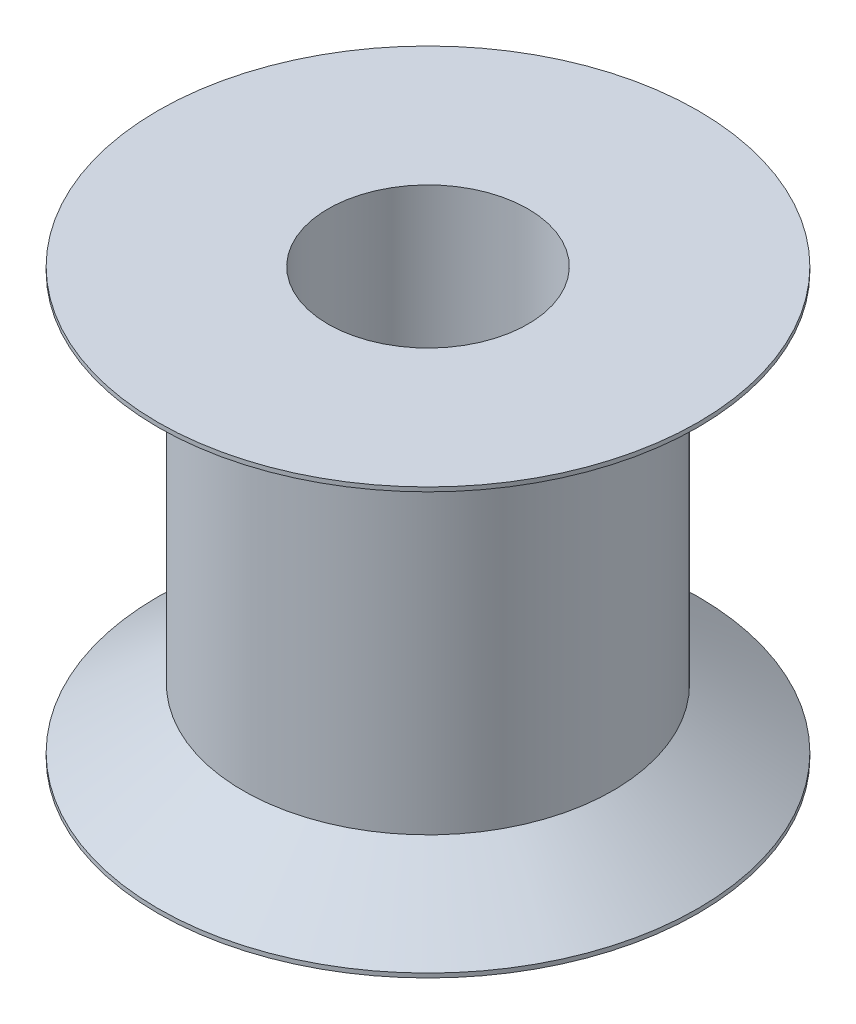
ISO-10303-21;
HEADER;
FILE_DESCRIPTION(('STEP AP214'),'2;1');
FILE_NAME('part.step','',(''),(''),'','','');
FILE_SCHEMA(('AUTOMOTIVE_DESIGN { 1 0 10303 214 1 1 1 1 }'));
ENDSEC;
DATA;
#1=APPLICATION_CONTEXT('core data for automotive mechanical design processes');
#2=APPLICATION_PROTOCOL_DEFINITION('international standard','automotive_design',2000,#1);
#3=PRODUCT_CONTEXT('',#1,'mechanical');
#4=PRODUCT('Part','Part','',(#3));
#5=PRODUCT_RELATED_PRODUCT_CATEGORY('part','',(#4));
#6=PRODUCT_DEFINITION_FORMATION('','',#4);
#7=PRODUCT_DEFINITION_CONTEXT('part definition',#1,'design');
#8=PRODUCT_DEFINITION('design','',#6,#7);
#9=PRODUCT_DEFINITION_SHAPE('','',#8);
#10=(LENGTH_UNIT() NAMED_UNIT(*) SI_UNIT(.MILLI.,.METRE.));
#11=(NAMED_UNIT(*) PLANE_ANGLE_UNIT() SI_UNIT($,.RADIAN.));
#12=(NAMED_UNIT(*) SI_UNIT($,.STERADIAN.) SOLID_ANGLE_UNIT());
#13=UNCERTAINTY_MEASURE_WITH_UNIT(LENGTH_MEASURE(1.E-05),#10,'distance_accuracy_value','');
#14=(GEOMETRIC_REPRESENTATION_CONTEXT(3) GLOBAL_UNCERTAINTY_ASSIGNED_CONTEXT((#13)) GLOBAL_UNIT_ASSIGNED_CONTEXT((#10,
#11,#12)) REPRESENTATION_CONTEXT('',''));
#15=CARTESIAN_POINT('',(0.,0.,0.));
#16=DIRECTION('',(0.,0.,1.));
#17=DIRECTION('',(1.,0.,0.));
#18=AXIS2_PLACEMENT_3D('',#15,#16,#17);
#19=CARTESIAN_POINT('',(0.,5.,-6.35));
#20=DIRECTION('',(0.,1.,0.));
#21=DIRECTION('',(0.,0.,1.));
#22=AXIS2_PLACEMENT_3D('',#19,#20,#21);
#23=PLANE('',#22);
#24=CARTESIAN_POINT('',(0.,5.,0.));
#25=DIRECTION('',(0.,-1.,0.));
#26=DIRECTION('',(0.,0.,-1.));
#27=AXIS2_PLACEMENT_3D('',#24,#25,#26);
#28=CIRCLE('',#27,2.35);
#29=CARTESIAN_POINT('',(0.,5.,-2.35));
#30=VERTEX_POINT('',#29);
#31=EDGE_CURVE('E10',#30,#30,#28,.T.);
#32=ORIENTED_EDGE('',*,*,#31,.T.);
#33=EDGE_LOOP('',(#32));
#34=FACE_BOUND('',#33,.T.);
#35=CARTESIAN_POINT('',(0.,5.,0.));
#36=DIRECTION('',(0.,-1.,0.));
#37=DIRECTION('',(0.,0.,-1.));
#38=AXIS2_PLACEMENT_3D('',#35,#36,#37);
#39=CIRCLE('',#38,6.35);
#40=CARTESIAN_POINT('',(0.,5.,-6.35));
#41=VERTEX_POINT('',#40);
#42=EDGE_CURVE('E62',#41,#41,#39,.T.);
#43=ORIENTED_EDGE('',*,*,#42,.F.);
#44=EDGE_LOOP('',(#43));
#45=FACE_BOUND('',#44,.T.);
#46=ADVANCED_FACE('F34',(#34,#45),#23,.T.);
#47=CARTESIAN_POINT('',(0.,0.,0.));
#48=DIRECTION('',(0.,-1.,0.));
#49=DIRECTION('',(0.,0.,-1.));
#50=AXIS2_PLACEMENT_3D('',#47,#48,#49);
#51=CYLINDRICAL_SURFACE('',#50,2.35);
#52=CARTESIAN_POINT('',(0.,-5.,0.));
#53=DIRECTION('',(0.,-1.,0.));
#54=DIRECTION('',(0.,0.,-1.));
#55=AXIS2_PLACEMENT_3D('',#52,#53,#54);
#56=CIRCLE('',#55,2.35);
#57=CARTESIAN_POINT('',(0.,-5.,-2.35));
#58=VERTEX_POINT('',#57);
#59=EDGE_CURVE('E40',#58,#58,#56,.T.);
#60=ORIENTED_EDGE('',*,*,#59,.T.);
#61=EDGE_LOOP('',(#60));
#62=FACE_BOUND('',#61,.T.);
#63=ORIENTED_EDGE('',*,*,#31,.F.);
#64=EDGE_LOOP('',(#63));
#65=FACE_BOUND('',#64,.T.);
#66=ADVANCED_FACE('F70',(#62,#65),#51,.F.);
#67=CARTESIAN_POINT('',(0.,-5.,-2.35));
#68=DIRECTION('',(0.,-1.,0.));
#69=DIRECTION('',(0.,0.,-1.));
#70=AXIS2_PLACEMENT_3D('',#67,#68,#69);
#71=PLANE('',#70);
#72=CARTESIAN_POINT('',(0.,-5.,0.));
#73=DIRECTION('',(0.,-1.,0.));
#74=DIRECTION('',(0.,0.,-1.));
#75=AXIS2_PLACEMENT_3D('',#72,#73,#74);
#76=CIRCLE('',#75,6.35);
#77=CARTESIAN_POINT('',(0.,-5.,-6.35));
#78=VERTEX_POINT('',#77);
#79=EDGE_CURVE('E44',#78,#78,#76,.T.);
#80=ORIENTED_EDGE('',*,*,#79,.T.);
#81=EDGE_LOOP('',(#80));
#82=FACE_BOUND('',#81,.T.);
#83=ORIENTED_EDGE('',*,*,#59,.F.);
#84=EDGE_LOOP('',(#83));
#85=FACE_BOUND('',#84,.T.);
#86=ADVANCED_FACE('F74',(#82,#85),#71,.T.);
#87=CARTESIAN_POINT('',(0.,0.,0.));
#88=DIRECTION('',(0.,-1.,0.));
#89=DIRECTION('',(0.,0.,-1.));
#90=AXIS2_PLACEMENT_3D('',#87,#88,#89);
#91=CYLINDRICAL_SURFACE('',#90,6.35);
#92=CARTESIAN_POINT('',(0.,-4.9,0.));
#93=DIRECTION('',(0.,-1.,0.));
#94=DIRECTION('',(0.,0.,-1.));
#95=AXIS2_PLACEMENT_3D('',#92,#93,#94);
#96=CIRCLE('',#95,6.35);
#97=CARTESIAN_POINT('',(0.,-4.9,-6.35));
#98=VERTEX_POINT('',#97);
#99=EDGE_CURVE('E48',#98,#98,#96,.T.);
#100=ORIENTED_EDGE('',*,*,#99,.T.);
#101=EDGE_LOOP('',(#100));
#102=FACE_BOUND('',#101,.T.);
#103=ORIENTED_EDGE('',*,*,#79,.F.);
#104=EDGE_LOOP('',(#103));
#105=FACE_BOUND('',#104,.T.);
#106=ADVANCED_FACE('F78',(#102,#105),#91,.T.);
#107=CARTESIAN_POINT('',(0.,-4.9,0.));
#108=DIRECTION('',(0.,-1.,0.));
#109=DIRECTION('',(0.,0.,-1.));
#110=AXIS2_PLACEMENT_3D('',#107,#108,#109);
#111=CONICAL_SURFACE('',#110,6.35,0.960070362405688);
#112=CARTESIAN_POINT('',(0.,-3.5,0.));
#113=DIRECTION('',(0.,-1.,0.));
#114=DIRECTION('',(0.,0.,-1.));
#115=AXIS2_PLACEMENT_3D('',#112,#113,#114);
#116=CIRCLE('',#115,4.35);
#117=CARTESIAN_POINT('',(0.,-3.5,-4.35));
#118=VERTEX_POINT('',#117);
#119=EDGE_CURVE('E53',#118,#118,#116,.T.);
#120=ORIENTED_EDGE('',*,*,#119,.T.);
#121=EDGE_LOOP('',(#120));
#122=FACE_BOUND('',#121,.T.);
#123=ORIENTED_EDGE('',*,*,#99,.F.);
#124=EDGE_LOOP('',(#123));
#125=FACE_BOUND('',#124,.T.);
#126=ADVANCED_FACE('F85',(#122,#125),#111,.T.);
#127=CARTESIAN_POINT('',(0.,0.,0.));
#128=DIRECTION('',(0.,-1.,0.));
#129=DIRECTION('',(0.,0.,-1.));
#130=AXIS2_PLACEMENT_3D('',#127,#128,#129);
#131=CYLINDRICAL_SURFACE('',#130,4.35);
#132=CARTESIAN_POINT('',(0.,3.5,0.));
#133=DIRECTION('',(0.,-1.,0.));
#134=DIRECTION('',(0.,0.,-1.));
#135=AXIS2_PLACEMENT_3D('',#132,#133,#134);
#136=CIRCLE('',#135,4.35);
#137=CARTESIAN_POINT('',(0.,3.5,-4.35));
#138=VERTEX_POINT('',#137);
#139=EDGE_CURVE('E56',#138,#138,#136,.T.);
#140=ORIENTED_EDGE('',*,*,#139,.T.);
#141=EDGE_LOOP('',(#140));
#142=FACE_BOUND('',#141,.T.);
#143=ORIENTED_EDGE('',*,*,#119,.F.);
#144=EDGE_LOOP('',(#143));
#145=FACE_BOUND('',#144,.T.);
#146=ADVANCED_FACE('F89',(#142,#145),#131,.T.);
#147=CARTESIAN_POINT('',(0.,3.5,0.));
#148=DIRECTION('',(0.,1.,0.));
#149=DIRECTION('',(0.,0.,1.));
#150=AXIS2_PLACEMENT_3D('',#147,#148,#149);
#151=CONICAL_SURFACE('',#150,4.35,0.960070362405689);
#152=CARTESIAN_POINT('',(0.,4.9,0.));
#153=DIRECTION('',(0.,-1.,0.));
#154=DIRECTION('',(0.,0.,-1.));
#155=AXIS2_PLACEMENT_3D('',#152,#153,#154);
#156=CIRCLE('',#155,6.35);
#157=CARTESIAN_POINT('',(0.,4.9,-6.35));
#158=VERTEX_POINT('',#157);
#159=EDGE_CURVE('E59',#158,#158,#156,.T.);
#160=ORIENTED_EDGE('',*,*,#159,.T.);
#161=EDGE_LOOP('',(#160));
#162=FACE_BOUND('',#161,.T.);
#163=ORIENTED_EDGE('',*,*,#139,.F.);
#164=EDGE_LOOP('',(#163));
#165=FACE_BOUND('',#164,.T.);
#166=ADVANCED_FACE('F93',(#162,#165),#151,.T.);
#167=CARTESIAN_POINT('',(0.,0.,0.));
#168=DIRECTION('',(0.,-1.,0.));
#169=DIRECTION('',(0.,0.,-1.));
#170=AXIS2_PLACEMENT_3D('',#167,#168,#169);
#171=CYLINDRICAL_SURFACE('',#170,6.35);
#172=ORIENTED_EDGE('',*,*,#42,.T.);
#173=EDGE_LOOP('',(#172));
#174=FACE_BOUND('',#173,.T.);
#175=ORIENTED_EDGE('',*,*,#159,.F.);
#176=EDGE_LOOP('',(#175));
#177=FACE_BOUND('',#176,.T.);
#178=ADVANCED_FACE('F66',(#174,#177),#171,.T.);
#179=CLOSED_SHELL('',(#46,#66,#86,#106,#126,#146,#166,#178));
#180=MANIFOLD_SOLID_BREP('B2',#179);
#181=ADVANCED_BREP_SHAPE_REPRESENTATION('',(#18,#180),#14);
#182=SHAPE_DEFINITION_REPRESENTATION(#9,#181);
ENDSEC;
END-ISO-10303-21;
